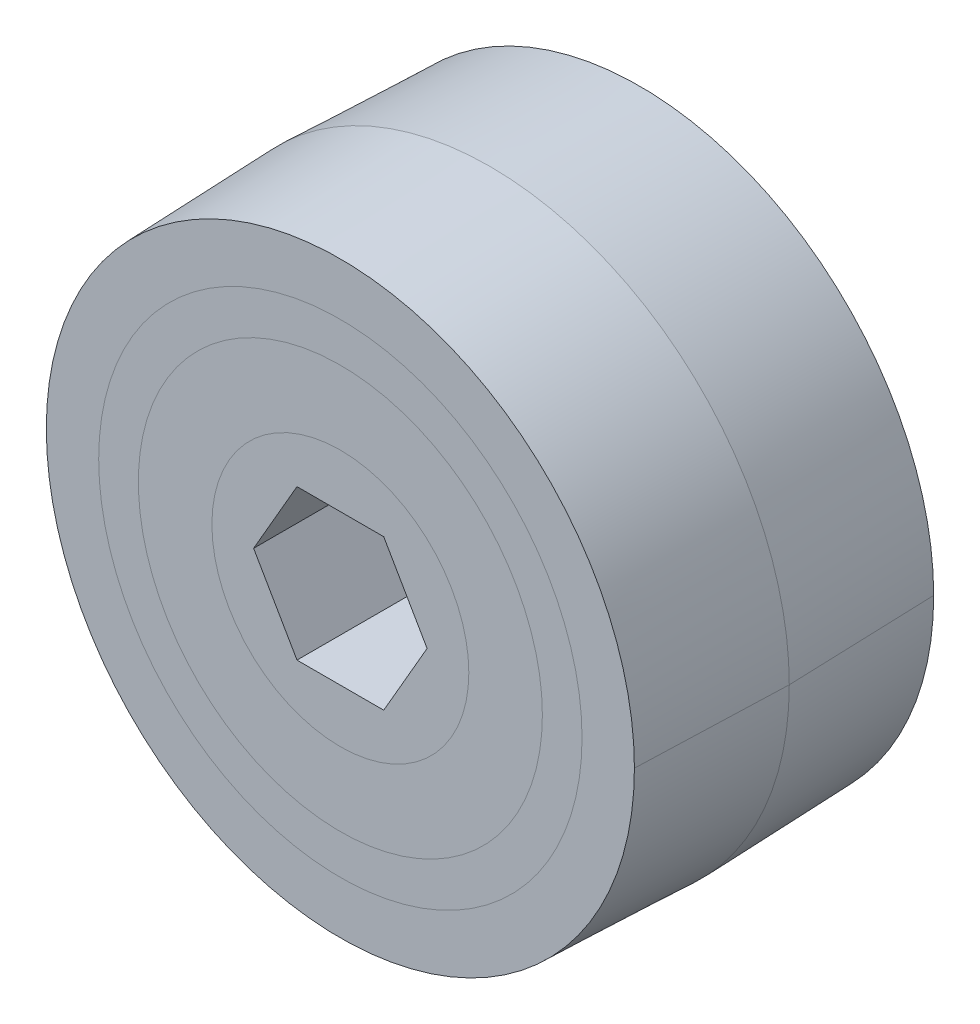
ISO-10303-21;
HEADER;
FILE_DESCRIPTION(('STEP AP214'),'2;1');
FILE_NAME('part.step','',(''),(''),'','','');
FILE_SCHEMA(('AUTOMOTIVE_DESIGN { 1 0 10303 214 1 1 1 1 }'));
ENDSEC;
DATA;
#1=APPLICATION_CONTEXT('core data for automotive mechanical design processes');
#2=APPLICATION_PROTOCOL_DEFINITION('international standard','automotive_design',2000,#1);
#3=PRODUCT_CONTEXT('',#1,'mechanical');
#4=PRODUCT('Part','Part','',(#3));
#5=PRODUCT_RELATED_PRODUCT_CATEGORY('part','',(#4));
#6=PRODUCT_DEFINITION_FORMATION('','',#4);
#7=PRODUCT_DEFINITION_CONTEXT('part definition',#1,'design');
#8=PRODUCT_DEFINITION('design','',#6,#7);
#9=PRODUCT_DEFINITION_SHAPE('','',#8);
#10=(LENGTH_UNIT() NAMED_UNIT(*) SI_UNIT(.MILLI.,.METRE.));
#11=(NAMED_UNIT(*) PLANE_ANGLE_UNIT() SI_UNIT($,.RADIAN.));
#12=(NAMED_UNIT(*) SI_UNIT($,.STERADIAN.) SOLID_ANGLE_UNIT());
#13=UNCERTAINTY_MEASURE_WITH_UNIT(LENGTH_MEASURE(1.E-05),#10,'distance_accuracy_value','');
#14=(GEOMETRIC_REPRESENTATION_CONTEXT(3) GLOBAL_UNCERTAINTY_ASSIGNED_CONTEXT((#13)) GLOBAL_UNIT_ASSIGNED_CONTEXT((#10,
#11,#12)) REPRESENTATION_CONTEXT('',''));
#15=CARTESIAN_POINT('',(0.,0.,0.));
#16=DIRECTION('',(0.,0.,1.));
#17=DIRECTION('',(1.,0.,0.));
#18=AXIS2_PLACEMENT_3D('',#15,#16,#17);
#19=CARTESIAN_POINT('',(20.955,20.955,-12.7));
#20=DIRECTION('',(0.,0.,-1.));
#21=DIRECTION('',(-1.,0.,0.));
#22=AXIS2_PLACEMENT_3D('',#19,#20,#21);
#23=CONICAL_SURFACE('',#22,25.4,0.0349065850398857);
#24=DIRECTION('',(0.0348994967025016,0.,-0.999390827019096));
#25=VECTOR('',#24,1.);
#26=CARTESIAN_POINT('',(46.355,20.955,-12.7));
#27=LINE('',#26,#25);
#28=CARTESIAN_POINT('',(45.9115062274548,20.955,0.));
#29=VERTEX_POINT('',#28);
#30=CARTESIAN_POINT('',(46.355,20.955,-12.7));
#31=VERTEX_POINT('',#30);
#32=EDGE_CURVE('E201',#29,#31,#27,.T.);
#33=ORIENTED_EDGE('',*,*,#32,.F.);
#34=CARTESIAN_POINT('',(20.955,20.955,0.));
#35=DIRECTION('',(0.,0.,1.));
#36=DIRECTION('',(1.,0.,0.));
#37=AXIS2_PLACEMENT_3D('',#34,#35,#36);
#38=CIRCLE('',#37,24.9565062274548);
#39=CARTESIAN_POINT('',(-4.0015062274548,20.955,0.));
#40=VERTEX_POINT('',#39);
#41=EDGE_CURVE('E202',#40,#29,#38,.T.);
#42=ORIENTED_EDGE('',*,*,#41,.F.);
#43=DIRECTION('',(-0.0348994967025016,0.,-0.999390827019096));
#44=VECTOR('',#43,1.);
#45=CARTESIAN_POINT('',(-4.445,20.955,-12.7));
#46=LINE('',#45,#44);
#47=CARTESIAN_POINT('',(-4.445,20.955,-12.7));
#48=VERTEX_POINT('',#47);
#49=EDGE_CURVE('E183',#40,#48,#46,.T.);
#50=ORIENTED_EDGE('',*,*,#49,.T.);
#51=CARTESIAN_POINT('',(20.955,20.955,-12.7));
#52=DIRECTION('',(0.,0.,1.));
#53=DIRECTION('',(1.,0.,0.));
#54=AXIS2_PLACEMENT_3D('',#51,#52,#53);
#55=CIRCLE('',#54,25.4);
#56=EDGE_CURVE('E189',#48,#31,#55,.T.);
#57=ORIENTED_EDGE('',*,*,#56,.T.);
#58=EDGE_LOOP('',(#33,#42,#50,#57));
#59=FACE_BOUND('',#58,.T.);
#60=ADVANCED_FACE('F16',(#59),#23,.T.);
#61=CARTESIAN_POINT('',(20.955,20.955,-25.4));
#62=DIRECTION('',(0.,0.,1.));
#63=DIRECTION('',(1.,0.,0.));
#64=AXIS2_PLACEMENT_3D('',#61,#62,#63);
#65=CONICAL_SURFACE('',#64,24.9565062274548,0.0349065850398857);
#66=DIRECTION('',(-0.0348994967025011,0.,0.999390827019096));
#67=VECTOR('',#66,1.);
#68=CARTESIAN_POINT('',(-4.0015062274548,20.955,-25.4));
#69=LINE('',#68,#67);
#70=CARTESIAN_POINT('',(-4.0015062274548,20.955,-25.4));
#71=VERTEX_POINT('',#70);
#72=EDGE_CURVE('E197',#71,#48,#69,.T.);
#73=ORIENTED_EDGE('',*,*,#72,.F.);
#74=CARTESIAN_POINT('',(20.955,20.955,-25.4));
#75=DIRECTION('',(0.,0.,1.));
#76=DIRECTION('',(1.,0.,0.));
#77=AXIS2_PLACEMENT_3D('',#74,#75,#76);
#78=CIRCLE('',#77,24.9565062274548);
#79=CARTESIAN_POINT('',(45.9115062274548,20.955,-25.4));
#80=VERTEX_POINT('',#79);
#81=EDGE_CURVE('E193',#71,#80,#78,.T.);
#82=ORIENTED_EDGE('',*,*,#81,.T.);
#83=DIRECTION('',(0.0348994967025011,0.,0.999390827019096));
#84=VECTOR('',#83,1.);
#85=CARTESIAN_POINT('',(45.9115062274548,20.955,-25.4));
#86=LINE('',#85,#84);
#87=EDGE_CURVE('E205',#80,#31,#86,.T.);
#88=ORIENTED_EDGE('',*,*,#87,.T.);
#89=ORIENTED_EDGE('',*,*,#56,.F.);
#90=EDGE_LOOP('',(#73,#82,#88,#89));
#91=FACE_BOUND('',#90,.T.);
#92=ADVANCED_FACE('F257',(#91),#65,.T.);
#93=CARTESIAN_POINT('',(20.955,45.9115062274548,-25.4));
#94=DIRECTION('',(0.,0.,1.));
#95=DIRECTION('',(1.,0.,0.));
#96=AXIS2_PLACEMENT_3D('',#93,#94,#95);
#97=PLANE('',#96);
#98=CARTESIAN_POINT('',(20.955,20.955,-25.4));
#99=DIRECTION('',(0.,0.,1.));
#100=DIRECTION('',(1.,0.,0.));
#101=AXIS2_PLACEMENT_3D('',#98,#99,#100);
#102=CIRCLE('',#101,20.5115062274548);
#103=CARTESIAN_POINT('',(41.4665062274548,20.955,-25.4));
#104=VERTEX_POINT('',#103);
#105=EDGE_CURVE('E10',#104,#104,#102,.T.);
#106=ORIENTED_EDGE('',*,*,#105,.T.);
#107=EDGE_LOOP('',(#106));
#108=FACE_BOUND('',#107,.T.);
#109=CARTESIAN_POINT('',(20.955,20.955,-25.4));
#110=DIRECTION('',(0.,0.,1.));
#111=DIRECTION('',(1.,0.,0.));
#112=AXIS2_PLACEMENT_3D('',#109,#110,#111);
#113=CIRCLE('',#112,24.9565062274548);
#114=EDGE_CURVE('E187',#80,#71,#113,.T.);
#115=ORIENTED_EDGE('',*,*,#114,.F.);
#116=ORIENTED_EDGE('',*,*,#81,.F.);
#117=EDGE_LOOP('',(#115,#116));
#118=FACE_BOUND('',#117,.T.);
#119=ADVANCED_FACE('F244',(#108,#118),#97,.F.);
#120=CARTESIAN_POINT('',(20.955,45.9115062274548,0.));
#121=DIRECTION('',(0.,0.,-1.));
#122=DIRECTION('',(0.,1.,0.));
#123=AXIS2_PLACEMENT_3D('',#120,#121,#122);
#124=PLANE('',#123);
#125=CARTESIAN_POINT('',(20.955,20.955,0.));
#126=DIRECTION('',(0.,0.,-1.));
#127=DIRECTION('',(-1.,0.,0.));
#128=AXIS2_PLACEMENT_3D('',#125,#126,#127);
#129=CIRCLE('',#128,20.5115062274549);
#130=CARTESIAN_POINT('',(0.443493772545111,20.955,0.));
#131=VERTEX_POINT('',#130);
#132=EDGE_CURVE('E223',#131,#131,#129,.F.);
#133=ORIENTED_EDGE('',*,*,#132,.F.);
#134=EDGE_LOOP('',(#133));
#135=FACE_BOUND('',#134,.T.);
#136=ORIENTED_EDGE('',*,*,#41,.T.);
#137=CARTESIAN_POINT('',(20.955,20.955,0.));
#138=DIRECTION('',(0.,0.,1.));
#139=DIRECTION('',(1.,0.,0.));
#140=AXIS2_PLACEMENT_3D('',#137,#138,#139);
#141=CIRCLE('',#140,24.9565062274548);
#142=EDGE_CURVE('E182',#29,#40,#141,.T.);
#143=ORIENTED_EDGE('',*,*,#142,.T.);
#144=EDGE_LOOP('',(#136,#143));
#145=FACE_BOUND('',#144,.T.);
#146=ADVANCED_FACE('F240',(#135,#145),#124,.F.);
#147=CARTESIAN_POINT('',(20.955,20.955,-25.4));
#148=DIRECTION('',(0.,0.,1.));
#149=DIRECTION('',(1.,0.,0.));
#150=AXIS2_PLACEMENT_3D('',#147,#148,#149);
#151=CONICAL_SURFACE('',#150,24.9565062274548,0.0349065850398857);
#152=ORIENTED_EDGE('',*,*,#114,.T.);
#153=ORIENTED_EDGE('',*,*,#72,.T.);
#154=CARTESIAN_POINT('',(20.955,20.955,-12.7));
#155=DIRECTION('',(0.,0.,1.));
#156=DIRECTION('',(1.,0.,0.));
#157=AXIS2_PLACEMENT_3D('',#154,#155,#156);
#158=CIRCLE('',#157,25.4);
#159=EDGE_CURVE('E188',#31,#48,#158,.T.);
#160=ORIENTED_EDGE('',*,*,#159,.F.);
#161=ORIENTED_EDGE('',*,*,#87,.F.);
#162=EDGE_LOOP('',(#152,#153,#160,#161));
#163=FACE_BOUND('',#162,.T.);
#164=ADVANCED_FACE('F243',(#163),#151,.T.);
#165=CARTESIAN_POINT('',(20.955,20.955,-12.7));
#166=DIRECTION('',(0.,0.,-1.));
#167=DIRECTION('',(-1.,0.,0.));
#168=AXIS2_PLACEMENT_3D('',#165,#166,#167);
#169=CONICAL_SURFACE('',#168,25.4,0.0349065850398857);
#170=ORIENTED_EDGE('',*,*,#142,.F.);
#171=ORIENTED_EDGE('',*,*,#32,.T.);
#172=ORIENTED_EDGE('',*,*,#159,.T.);
#173=ORIENTED_EDGE('',*,*,#49,.F.);
#174=EDGE_LOOP('',(#170,#171,#172,#173));
#175=FACE_BOUND('',#174,.T.);
#176=ADVANCED_FACE('F237',(#175),#169,.T.);
#177=CARTESIAN_POINT('',(20.955,20.955,0.));
#178=DIRECTION('',(0.,0.,1.));
#179=DIRECTION('',(1.,0.,0.));
#180=AXIS2_PLACEMENT_3D('',#177,#178,#179);
#181=PLANE('',#180);
#182=CARTESIAN_POINT('',(20.955,20.955,0.));
#183=DIRECTION('',(0.,0.,1.));
#184=DIRECTION('',(1.,0.,0.));
#185=AXIS2_PLACEMENT_3D('',#182,#183,#184);
#186=CIRCLE('',#185,17.145);
#187=CARTESIAN_POINT('',(38.1,20.955,0.));
#188=VERTEX_POINT('',#187);
#189=EDGE_CURVE('E25',#188,#188,#186,.T.);
#190=ORIENTED_EDGE('',*,*,#189,.F.);
#191=EDGE_LOOP('',(#190));
#192=FACE_BOUND('',#191,.T.);
#193=ORIENTED_EDGE('',*,*,#132,.T.);
#194=EDGE_LOOP('',(#193));
#195=FACE_BOUND('',#194,.T.);
#196=ADVANCED_FACE('F234',(#192,#195),#181,.T.);
#197=CARTESIAN_POINT('',(41.4665062274548,20.955,-25.4));
#198=DIRECTION('',(0.,0.,-1.));
#199=DIRECTION('',(-1.,0.,0.));
#200=AXIS2_PLACEMENT_3D('',#197,#198,#199);
#201=PLANE('',#200);
#202=DIRECTION('',(1.,0.,0.));
#203=VECTOR('',#202,1.);
#204=CARTESIAN_POINT('',(17.2741610938085,14.5796,-25.4));
#205=LINE('',#204,#203);
#206=CARTESIAN_POINT('',(17.2741610938085,14.5796,-25.4));
#207=VERTEX_POINT('',#206);
#208=CARTESIAN_POINT('',(24.6358389061915,14.5796,-25.4));
#209=VERTEX_POINT('',#208);
#210=EDGE_CURVE('E178',#207,#209,#205,.T.);
#211=ORIENTED_EDGE('',*,*,#210,.T.);
#212=DIRECTION('',(0.5,0.866025403784439,0.));
#213=VECTOR('',#212,1.);
#214=CARTESIAN_POINT('',(24.6358389061915,14.5796,-25.4));
#215=LINE('',#214,#213);
#216=CARTESIAN_POINT('',(28.3166778123831,20.955,-25.4));
#217=VERTEX_POINT('',#216);
#218=EDGE_CURVE('E122',#209,#217,#215,.T.);
#219=ORIENTED_EDGE('',*,*,#218,.T.);
#220=DIRECTION('',(-0.5,0.866025403784438,0.));
#221=VECTOR('',#220,1.);
#222=CARTESIAN_POINT('',(28.3166778123831,20.955,-25.4));
#223=LINE('',#222,#221);
#224=CARTESIAN_POINT('',(24.6358389061915,27.3304,-25.4));
#225=VERTEX_POINT('',#224);
#226=EDGE_CURVE('E36',#217,#225,#223,.T.);
#227=ORIENTED_EDGE('',*,*,#226,.T.);
#228=DIRECTION('',(-1.,0.,0.));
#229=VECTOR('',#228,1.);
#230=CARTESIAN_POINT('',(24.6358389061915,27.3304,-25.4));
#231=LINE('',#230,#229);
#232=CARTESIAN_POINT('',(17.2741610938085,27.3304,-25.4));
#233=VERTEX_POINT('',#232);
#234=EDGE_CURVE('E151',#225,#233,#231,.T.);
#235=ORIENTED_EDGE('',*,*,#234,.T.);
#236=DIRECTION('',(-0.5,-0.866025403784439,0.));
#237=VECTOR('',#236,1.);
#238=CARTESIAN_POINT('',(17.2741610938085,27.3304,-25.4));
#239=LINE('',#238,#237);
#240=CARTESIAN_POINT('',(13.5933221876169,20.955,-25.4));
#241=VERTEX_POINT('',#240);
#242=EDGE_CURVE('E162',#233,#241,#239,.T.);
#243=ORIENTED_EDGE('',*,*,#242,.T.);
#244=DIRECTION('',(0.5,-0.866025403784438,0.));
#245=VECTOR('',#244,1.);
#246=CARTESIAN_POINT('',(13.5933221876169,20.955,-25.4));
#247=LINE('',#246,#245);
#248=EDGE_CURVE('E172',#241,#207,#247,.T.);
#249=ORIENTED_EDGE('',*,*,#248,.T.);
#250=EDGE_LOOP('',(#211,#219,#227,#235,#243,#249));
#251=FACE_BOUND('',#250,.T.);
#252=ORIENTED_EDGE('',*,*,#105,.F.);
#253=EDGE_LOOP('',(#252));
#254=FACE_BOUND('',#253,.T.);
#255=ADVANCED_FACE('F18',(#251,#254),#201,.T.);
#256=CARTESIAN_POINT('',(20.955,20.955,0.));
#257=DIRECTION('',(0.,0.,-1.));
#258=DIRECTION('',(-1.,0.,0.));
#259=AXIS2_PLACEMENT_3D('',#256,#257,#258);
#260=CIRCLE('',#259,10.9032974947186);
#261=CARTESIAN_POINT('',(10.0517025052814,20.955,0.));
#262=VERTEX_POINT('',#261);
#263=EDGE_CURVE('E192',#262,#262,#260,.F.);
#264=ORIENTED_EDGE('',*,*,#263,.F.);
#265=EDGE_LOOP('',(#264));
#266=FACE_BOUND('',#265,.T.);
#267=ORIENTED_EDGE('',*,*,#189,.T.);
#268=EDGE_LOOP('',(#267));
#269=FACE_BOUND('',#268,.T.);
#270=ADVANCED_FACE('F232',(#266,#269),#124,.F.);
#271=CARTESIAN_POINT('',(20.955,20.955,0.));
#272=DIRECTION('',(0.,0.,1.));
#273=DIRECTION('',(1.,0.,0.));
#274=AXIS2_PLACEMENT_3D('',#271,#272,#273);
#275=PLANE('',#274);
#276=DIRECTION('',(1.,0.,0.));
#277=VECTOR('',#276,1.);
#278=CARTESIAN_POINT('',(17.2741610938085,14.5796,0.));
#279=LINE('',#278,#277);
#280=CARTESIAN_POINT('',(17.2741610938085,14.5796,0.));
#281=VERTEX_POINT('',#280);
#282=CARTESIAN_POINT('',(24.6358389061915,14.5796,0.));
#283=VERTEX_POINT('',#282);
#284=EDGE_CURVE('E46',#281,#283,#279,.T.);
#285=ORIENTED_EDGE('',*,*,#284,.F.);
#286=DIRECTION('',(0.5,-0.866025403784438,0.));
#287=VECTOR('',#286,1.);
#288=CARTESIAN_POINT('',(13.5933221876169,20.955,0.));
#289=LINE('',#288,#287);
#290=CARTESIAN_POINT('',(13.5933221876169,20.955,0.));
#291=VERTEX_POINT('',#290);
#292=EDGE_CURVE('E166',#291,#281,#289,.T.);
#293=ORIENTED_EDGE('',*,*,#292,.F.);
#294=DIRECTION('',(-0.5,-0.866025403784439,0.));
#295=VECTOR('',#294,1.);
#296=CARTESIAN_POINT('',(17.2741610938085,27.3304,0.));
#297=LINE('',#296,#295);
#298=CARTESIAN_POINT('',(17.2741610938085,27.3304,0.));
#299=VERTEX_POINT('',#298);
#300=EDGE_CURVE('E155',#299,#291,#297,.T.);
#301=ORIENTED_EDGE('',*,*,#300,.F.);
#302=DIRECTION('',(-1.,0.,0.));
#303=VECTOR('',#302,1.);
#304=CARTESIAN_POINT('',(24.6358389061915,27.3304,0.));
#305=LINE('',#304,#303);
#306=CARTESIAN_POINT('',(24.6358389061915,27.3304,0.));
#307=VERTEX_POINT('',#306);
#308=EDGE_CURVE('E132',#307,#299,#305,.T.);
#309=ORIENTED_EDGE('',*,*,#308,.F.);
#310=DIRECTION('',(-0.5,0.866025403784438,0.));
#311=VECTOR('',#310,1.);
#312=CARTESIAN_POINT('',(28.3166778123831,20.955,0.));
#313=LINE('',#312,#311);
#314=CARTESIAN_POINT('',(28.3166778123831,20.955,0.));
#315=VERTEX_POINT('',#314);
#316=EDGE_CURVE('E125',#315,#307,#313,.T.);
#317=ORIENTED_EDGE('',*,*,#316,.F.);
#318=DIRECTION('',(0.5,0.866025403784439,0.));
#319=VECTOR('',#318,1.);
#320=CARTESIAN_POINT('',(24.6358389061915,14.5796,0.));
#321=LINE('',#320,#319);
#322=EDGE_CURVE('E114',#283,#315,#321,.T.);
#323=ORIENTED_EDGE('',*,*,#322,.F.);
#324=EDGE_LOOP('',(#285,#293,#301,#309,#317,#323));
#325=FACE_BOUND('',#324,.T.);
#326=ORIENTED_EDGE('',*,*,#263,.T.);
#327=EDGE_LOOP('',(#326));
#328=FACE_BOUND('',#327,.T.);
#329=ADVANCED_FACE('F129',(#325,#328),#275,.T.);
#330=CARTESIAN_POINT('',(17.2741610938085,14.5796,-25.4));
#331=DIRECTION('',(0.,-1.,0.));
#332=DIRECTION('',(0.,0.,-1.));
#333=AXIS2_PLACEMENT_3D('',#330,#331,#332);
#334=PLANE('',#333);
#335=ORIENTED_EDGE('',*,*,#284,.T.);
#336=DIRECTION('',(0.,0.,1.));
#337=VECTOR('',#336,1.);
#338=CARTESIAN_POINT('',(24.6358389061915,14.5796,-25.4));
#339=LINE('',#338,#337);
#340=EDGE_CURVE('E118',#209,#283,#339,.T.);
#341=ORIENTED_EDGE('',*,*,#340,.F.);
#342=ORIENTED_EDGE('',*,*,#210,.F.);
#343=DIRECTION('',(0.,0.,1.));
#344=VECTOR('',#343,1.);
#345=CARTESIAN_POINT('',(17.2741610938085,14.5796,-25.4));
#346=LINE('',#345,#344);
#347=EDGE_CURVE('E169',#207,#281,#346,.T.);
#348=ORIENTED_EDGE('',*,*,#347,.T.);
#349=EDGE_LOOP('',(#335,#341,#342,#348));
#350=FACE_BOUND('',#349,.T.);
#351=ADVANCED_FACE('F274',(#350),#334,.F.);
#352=CARTESIAN_POINT('',(13.5933221876169,20.955,-25.4));
#353=DIRECTION('',(-0.866025403784438,-0.5,0.));
#354=DIRECTION('',(0.5,-0.866025403784439,0.));
#355=AXIS2_PLACEMENT_3D('',#352,#353,#354);
#356=PLANE('',#355);
#357=ORIENTED_EDGE('',*,*,#292,.T.);
#358=ORIENTED_EDGE('',*,*,#347,.F.);
#359=ORIENTED_EDGE('',*,*,#248,.F.);
#360=DIRECTION('',(0.,0.,1.));
#361=VECTOR('',#360,1.);
#362=CARTESIAN_POINT('',(13.5933221876169,20.955,-25.4));
#363=LINE('',#362,#361);
#364=EDGE_CURVE('E158',#241,#291,#363,.T.);
#365=ORIENTED_EDGE('',*,*,#364,.T.);
#366=EDGE_LOOP('',(#357,#358,#359,#365));
#367=FACE_BOUND('',#366,.T.);
#368=ADVANCED_FACE('F280',(#367),#356,.F.);
#369=CARTESIAN_POINT('',(17.2741610938085,27.3304,-25.4));
#370=DIRECTION('',(-0.866025403784439,0.5,0.));
#371=DIRECTION('',(-0.5,-0.866025403784439,0.));
#372=AXIS2_PLACEMENT_3D('',#369,#370,#371);
#373=PLANE('',#372);
#374=ORIENTED_EDGE('',*,*,#300,.T.);
#375=ORIENTED_EDGE('',*,*,#364,.F.);
#376=ORIENTED_EDGE('',*,*,#242,.F.);
#377=DIRECTION('',(0.,0.,1.));
#378=VECTOR('',#377,1.);
#379=CARTESIAN_POINT('',(17.2741610938085,27.3304,-25.4));
#380=LINE('',#379,#378);
#381=EDGE_CURVE('E147',#233,#299,#380,.T.);
#382=ORIENTED_EDGE('',*,*,#381,.T.);
#383=EDGE_LOOP('',(#374,#375,#376,#382));
#384=FACE_BOUND('',#383,.T.);
#385=ADVANCED_FACE('F345',(#384),#373,.F.);
#386=CARTESIAN_POINT('',(24.6358389061915,27.3304,-25.4));
#387=DIRECTION('',(0.,1.,0.));
#388=DIRECTION('',(0.,0.,1.));
#389=AXIS2_PLACEMENT_3D('',#386,#387,#388);
#390=PLANE('',#389);
#391=ORIENTED_EDGE('',*,*,#308,.T.);
#392=ORIENTED_EDGE('',*,*,#381,.F.);
#393=ORIENTED_EDGE('',*,*,#234,.F.);
#394=DIRECTION('',(0.,0.,1.));
#395=VECTOR('',#394,1.);
#396=CARTESIAN_POINT('',(24.6358389061915,27.3304,-25.4));
#397=LINE('',#396,#395);
#398=EDGE_CURVE('E134',#225,#307,#397,.T.);
#399=ORIENTED_EDGE('',*,*,#398,.T.);
#400=EDGE_LOOP('',(#391,#392,#393,#399));
#401=FACE_BOUND('',#400,.T.);
#402=ADVANCED_FACE('F356',(#401),#390,.F.);
#403=CARTESIAN_POINT('',(28.3166778123831,20.955,-25.4));
#404=DIRECTION('',(0.866025403784438,0.500000000000001,0.));
#405=DIRECTION('',(-0.500000000000001,0.866025403784438,0.));
#406=AXIS2_PLACEMENT_3D('',#403,#404,#405);
#407=PLANE('',#406);
#408=ORIENTED_EDGE('',*,*,#316,.T.);
#409=ORIENTED_EDGE('',*,*,#398,.F.);
#410=ORIENTED_EDGE('',*,*,#226,.F.);
#411=DIRECTION('',(0.,0.,1.));
#412=VECTOR('',#411,1.);
#413=CARTESIAN_POINT('',(28.3166778123831,20.955,-25.4));
#414=LINE('',#413,#412);
#415=EDGE_CURVE('E116',#217,#315,#414,.T.);
#416=ORIENTED_EDGE('',*,*,#415,.T.);
#417=EDGE_LOOP('',(#408,#409,#410,#416));
#418=FACE_BOUND('',#417,.T.);
#419=ADVANCED_FACE('F124',(#418),#407,.F.);
#420=CARTESIAN_POINT('',(24.6358389061915,14.5796,-25.4));
#421=DIRECTION('',(0.866025403784438,-0.5,0.));
#422=DIRECTION('',(0.5,0.866025403784439,0.));
#423=AXIS2_PLACEMENT_3D('',#420,#421,#422);
#424=PLANE('',#423);
#425=ORIENTED_EDGE('',*,*,#322,.T.);
#426=ORIENTED_EDGE('',*,*,#415,.F.);
#427=ORIENTED_EDGE('',*,*,#218,.F.);
#428=ORIENTED_EDGE('',*,*,#340,.T.);
#429=EDGE_LOOP('',(#425,#426,#427,#428));
#430=FACE_BOUND('',#429,.T.);
#431=ADVANCED_FACE('F115',(#430),#424,.F.);
#432=CLOSED_SHELL('',(#60,#92,#119,#146,#164,#176,#196,#255,#270,#329,#351,#368,#385,#402,#419,#431));
#433=MANIFOLD_SOLID_BREP('B1',#432);
#434=ADVANCED_BREP_SHAPE_REPRESENTATION('',(#18,#433),#14);
#435=SHAPE_DEFINITION_REPRESENTATION(#9,#434);
ENDSEC;
END-ISO-10303-21;
